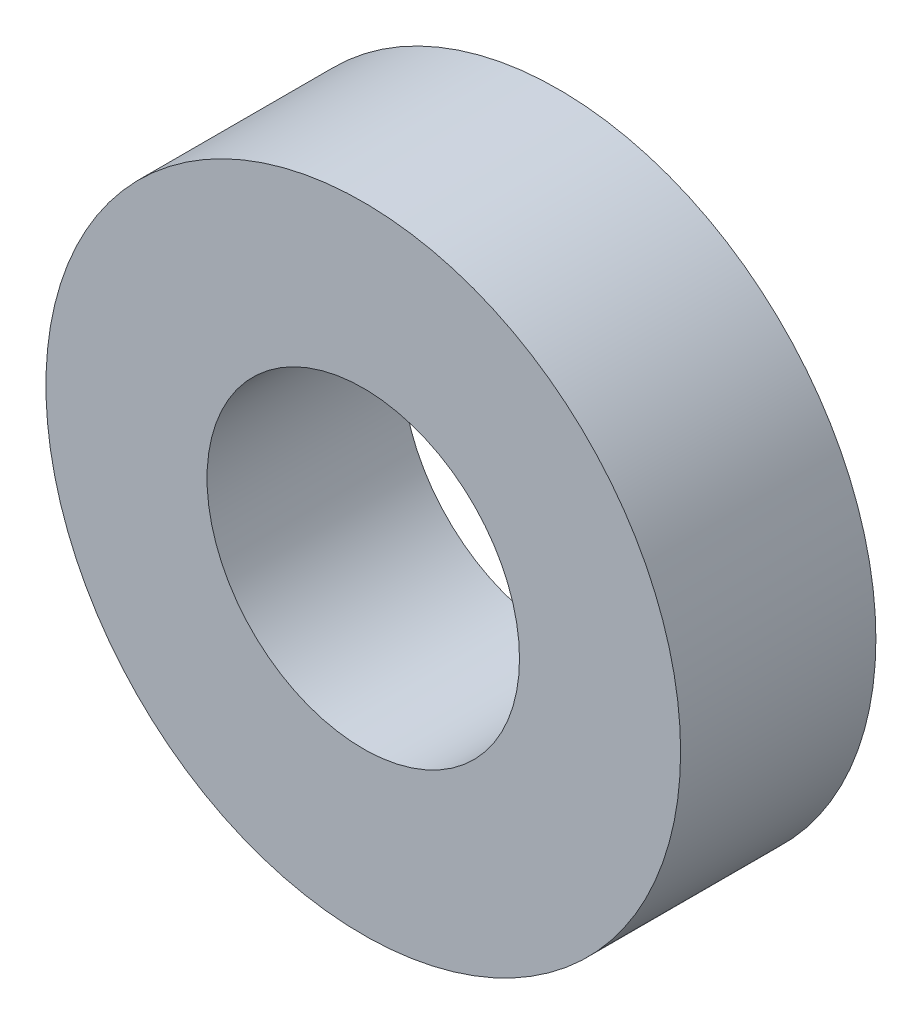
ISO-10303-21;
HEADER;
FILE_DESCRIPTION(('STEP AP214'),'2;1');
FILE_NAME('part.step','',(''),(''),'','','');
FILE_SCHEMA(('AUTOMOTIVE_DESIGN { 1 0 10303 214 1 1 1 1 }'));
ENDSEC;
DATA;
#1=APPLICATION_CONTEXT('core data for automotive mechanical design processes');
#2=APPLICATION_PROTOCOL_DEFINITION('international standard','automotive_design',2000,#1);
#3=PRODUCT_CONTEXT('',#1,'mechanical');
#4=PRODUCT('Part','Part','',(#3));
#5=PRODUCT_RELATED_PRODUCT_CATEGORY('part','',(#4));
#6=PRODUCT_DEFINITION_FORMATION('','',#4);
#7=PRODUCT_DEFINITION_CONTEXT('part definition',#1,'design');
#8=PRODUCT_DEFINITION('design','',#6,#7);
#9=PRODUCT_DEFINITION_SHAPE('','',#8);
#10=(LENGTH_UNIT() NAMED_UNIT(*) SI_UNIT(.MILLI.,.METRE.));
#11=(NAMED_UNIT(*) PLANE_ANGLE_UNIT() SI_UNIT($,.RADIAN.));
#12=(NAMED_UNIT(*) SI_UNIT($,.STERADIAN.) SOLID_ANGLE_UNIT());
#13=UNCERTAINTY_MEASURE_WITH_UNIT(LENGTH_MEASURE(1.E-05),#10,'distance_accuracy_value','');
#14=(GEOMETRIC_REPRESENTATION_CONTEXT(3) GLOBAL_UNCERTAINTY_ASSIGNED_CONTEXT((#13)) GLOBAL_UNIT_ASSIGNED_CONTEXT((#10,
#11,#12)) REPRESENTATION_CONTEXT('',''));
#15=CARTESIAN_POINT('',(0.,0.,0.));
#16=DIRECTION('',(0.,0.,1.));
#17=DIRECTION('',(1.,0.,0.));
#18=AXIS2_PLACEMENT_3D('',#15,#16,#17);
#19=CARTESIAN_POINT('',(0.,0.,4.));
#20=DIRECTION('',(0.,0.,1.));
#21=DIRECTION('',(1.,0.,0.));
#22=AXIS2_PLACEMENT_3D('',#19,#20,#21);
#23=PLANE('',#22);
#24=CARTESIAN_POINT('',(0.,0.,4.));
#25=DIRECTION('',(0.,0.,1.));
#26=DIRECTION('',(1.,0.,0.));
#27=AXIS2_PLACEMENT_3D('',#24,#25,#26);
#28=CIRCLE('',#27,6.5);
#29=CARTESIAN_POINT('',(6.5,0.,4.));
#30=VERTEX_POINT('',#29);
#31=EDGE_CURVE('E10',#30,#30,#28,.T.);
#32=ORIENTED_EDGE('',*,*,#31,.T.);
#33=EDGE_LOOP('',(#32));
#34=FACE_BOUND('',#33,.T.);
#35=CARTESIAN_POINT('',(0.,0.,4.));
#36=DIRECTION('',(0.,0.,1.));
#37=DIRECTION('',(1.,0.,0.));
#38=AXIS2_PLACEMENT_3D('',#35,#36,#37);
#39=CIRCLE('',#38,3.2);
#40=CARTESIAN_POINT('',(3.2,0.,4.));
#41=VERTEX_POINT('',#40);
#42=EDGE_CURVE('E50',#41,#41,#39,.T.);
#43=ORIENTED_EDGE('',*,*,#42,.F.);
#44=EDGE_LOOP('',(#43));
#45=FACE_BOUND('',#44,.T.);
#46=ADVANCED_FACE('F39',(#34,#45),#23,.T.);
#47=CARTESIAN_POINT('',(0.,0.,0.));
#48=DIRECTION('',(0.,0.,1.));
#49=DIRECTION('',(1.,0.,0.));
#50=AXIS2_PLACEMENT_3D('',#47,#48,#49);
#51=PLANE('',#50);
#52=CARTESIAN_POINT('',(0.,0.,0.));
#53=DIRECTION('',(0.,0.,1.));
#54=DIRECTION('',(1.,0.,0.));
#55=AXIS2_PLACEMENT_3D('',#52,#53,#54);
#56=CIRCLE('',#55,6.5);
#57=CARTESIAN_POINT('',(6.5,0.,0.));
#58=VERTEX_POINT('',#57);
#59=EDGE_CURVE('E43',#58,#58,#56,.T.);
#60=ORIENTED_EDGE('',*,*,#59,.F.);
#61=EDGE_LOOP('',(#60));
#62=FACE_BOUND('',#61,.T.);
#63=CARTESIAN_POINT('',(0.,0.,0.));
#64=DIRECTION('',(0.,0.,1.));
#65=DIRECTION('',(1.,0.,0.));
#66=AXIS2_PLACEMENT_3D('',#63,#64,#65);
#67=CIRCLE('',#66,3.2);
#68=CARTESIAN_POINT('',(3.2,0.,0.));
#69=VERTEX_POINT('',#68);
#70=EDGE_CURVE('E52',#69,#69,#67,.T.);
#71=ORIENTED_EDGE('',*,*,#70,.T.);
#72=EDGE_LOOP('',(#71));
#73=FACE_BOUND('',#72,.T.);
#74=ADVANCED_FACE('F62',(#62,#73),#51,.F.);
#75=CARTESIAN_POINT('',(0.,0.,4.));
#76=DIRECTION('',(0.,0.,-1.));
#77=DIRECTION('',(-1.,0.,0.));
#78=AXIS2_PLACEMENT_3D('',#75,#76,#77);
#79=CYLINDRICAL_SURFACE('',#78,6.5);
#80=ORIENTED_EDGE('',*,*,#31,.F.);
#81=EDGE_LOOP('',(#80));
#82=FACE_BOUND('',#81,.T.);
#83=ORIENTED_EDGE('',*,*,#59,.T.);
#84=EDGE_LOOP('',(#83));
#85=FACE_BOUND('',#84,.T.);
#86=ADVANCED_FACE('F41',(#82,#85),#79,.T.);
#87=CARTESIAN_POINT('',(0.,0.,4.));
#88=DIRECTION('',(0.,0.,-1.));
#89=DIRECTION('',(-1.,0.,0.));
#90=AXIS2_PLACEMENT_3D('',#87,#88,#89);
#91=CYLINDRICAL_SURFACE('',#90,3.2);
#92=ORIENTED_EDGE('',*,*,#42,.T.);
#93=EDGE_LOOP('',(#92));
#94=FACE_BOUND('',#93,.T.);
#95=ORIENTED_EDGE('',*,*,#70,.F.);
#96=EDGE_LOOP('',(#95));
#97=FACE_BOUND('',#96,.T.);
#98=ADVANCED_FACE('F58',(#94,#97),#91,.F.);
#99=CLOSED_SHELL('',(#46,#74,#86,#98));
#100=MANIFOLD_SOLID_BREP('B2',#99);
#101=ADVANCED_BREP_SHAPE_REPRESENTATION('',(#18,#100),#14);
#102=SHAPE_DEFINITION_REPRESENTATION(#9,#101);
ENDSEC;
END-ISO-10303-21;
